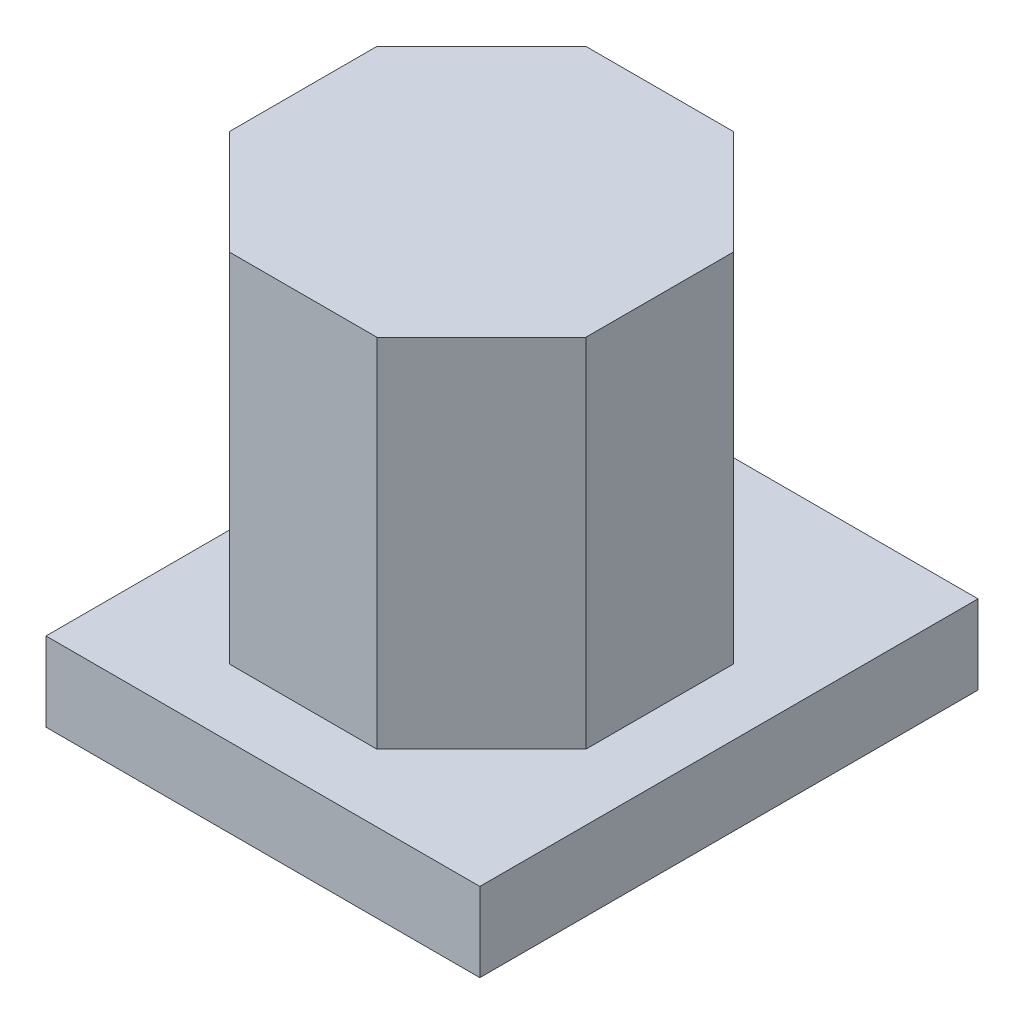
ISO-10303-21;
HEADER;
FILE_DESCRIPTION(('STEP AP214'),'2;1');
FILE_NAME('part.step','',(''),(''),'','','');
FILE_SCHEMA(('AUTOMOTIVE_DESIGN { 1 0 10303 214 1 1 1 1 }'));
ENDSEC;
DATA;
#1=APPLICATION_CONTEXT('core data for automotive mechanical design processes');
#2=APPLICATION_PROTOCOL_DEFINITION('international standard','automotive_design',2000,#1);
#3=PRODUCT_CONTEXT('',#1,'mechanical');
#4=PRODUCT('Part','Part','',(#3));
#5=PRODUCT_RELATED_PRODUCT_CATEGORY('part','',(#4));
#6=PRODUCT_DEFINITION_FORMATION('','',#4);
#7=PRODUCT_DEFINITION_CONTEXT('part definition',#1,'design');
#8=PRODUCT_DEFINITION('design','',#6,#7);
#9=PRODUCT_DEFINITION_SHAPE('','',#8);
#10=(LENGTH_UNIT() NAMED_UNIT(*) SI_UNIT(.MILLI.,.METRE.));
#11=(NAMED_UNIT(*) PLANE_ANGLE_UNIT() SI_UNIT($,.RADIAN.));
#12=(NAMED_UNIT(*) SI_UNIT($,.STERADIAN.) SOLID_ANGLE_UNIT());
#13=UNCERTAINTY_MEASURE_WITH_UNIT(LENGTH_MEASURE(1.E-05),#10,'distance_accuracy_value','');
#14=(GEOMETRIC_REPRESENTATION_CONTEXT(3) GLOBAL_UNCERTAINTY_ASSIGNED_CONTEXT((#13)) GLOBAL_UNIT_ASSIGNED_CONTEXT((#10,
#11,#12)) REPRESENTATION_CONTEXT('',''));
#15=CARTESIAN_POINT('',(0.,0.,0.));
#16=DIRECTION('',(0.,0.,1.));
#17=DIRECTION('',(1.,0.,0.));
#18=AXIS2_PLACEMENT_3D('',#15,#16,#17);
#19=CARTESIAN_POINT('',(380.,-709.,1072.));
#20=CARTESIAN_POINT('',(940.,-709.,1072.));
#21=CARTESIAN_POINT('',(380.,-709.,429.));
#22=CARTESIAN_POINT('',(940.,-709.,429.));
#23=B_SPLINE_SURFACE_WITH_KNOTS('',1,1,((#19,#20),(#21,#22)),.UNSPECIFIED.,.F.,.F.,.F.,(2,2),(2,
2),(-317.,326.),(-245.,315.),.UNSPECIFIED.);
#24=CARTESIAN_POINT('',(940.,-709.,1072.));
#25=CARTESIAN_POINT('',(940.,-709.,429.));
#26=B_SPLINE_CURVE_WITH_KNOTS('',1,(#24,#25),.UNSPECIFIED.,.F.,.F.,(2,2),(0.,643.),.UNSPECIFIED.);
#27=CARTESIAN_POINT('',(940.,-709.,1072.));
#28=VERTEX_POINT('',#27);
#29=CARTESIAN_POINT('',(940.,-709.,429.));
#30=VERTEX_POINT('',#29);
#31=EDGE_CURVE('E150',#28,#30,#26,.T.);
#32=CARTESIAN_POINT('',(380.,-709.,1072.));
#33=CARTESIAN_POINT('',(940.,-709.,1072.));
#34=B_SPLINE_CURVE_WITH_KNOTS('',1,(#32,#33),.UNSPECIFIED.,.F.,.F.,(2,2),(0.,560.),.UNSPECIFIED.);
#35=CARTESIAN_POINT('',(380.,-709.,1072.));
#36=VERTEX_POINT('',#35);
#37=EDGE_CURVE('E133',#36,#28,#34,.T.);
#38=CARTESIAN_POINT('',(380.,-709.,429.));
#39=CARTESIAN_POINT('',(380.,-709.,1072.));
#40=B_SPLINE_CURVE_WITH_KNOTS('',1,(#38,#39),.UNSPECIFIED.,.F.,.F.,(2,2),(0.,643.),.UNSPECIFIED.);
#41=CARTESIAN_POINT('',(380.,-709.,429.));
#42=VERTEX_POINT('',#41);
#43=EDGE_CURVE('E146',#42,#36,#40,.T.);
#44=CARTESIAN_POINT('',(940.,-709.,429.));
#45=CARTESIAN_POINT('',(380.,-709.,429.));
#46=B_SPLINE_CURVE_WITH_KNOTS('',1,(#44,#45),.UNSPECIFIED.,.F.,.F.,(2,2),(0.,560.),.UNSPECIFIED.);
#47=EDGE_CURVE('E153',#30,#42,#46,.T.);
#48=ORIENTED_EDGE('',*,*,#31,.F.);
#49=ORIENTED_EDGE('',*,*,#37,.F.);
#50=ORIENTED_EDGE('',*,*,#43,.F.);
#51=ORIENTED_EDGE('',*,*,#47,.F.);
#52=EDGE_LOOP('',(#48,#49,#50,#51));
#53=FACE_BOUND('',#52,.T.);
#54=ADVANCED_FACE('F18',(#53),#23,.T.);
#55=CARTESIAN_POINT('',(940.,-607.,1072.));
#56=CARTESIAN_POINT('',(940.,-709.,1072.));
#57=CARTESIAN_POINT('',(380.,-607.,1072.));
#58=CARTESIAN_POINT('',(380.,-709.,1072.));
#59=B_SPLINE_SURFACE_WITH_KNOTS('',1,1,((#55,#56),(#57,#58)),.UNSPECIFIED.,.F.,.F.,.F.,(2,2),(2,
2),(0.,560.),(0.,102.),.UNSPECIFIED.);
#60=CARTESIAN_POINT('',(940.,-607.,1072.));
#61=CARTESIAN_POINT('',(940.,-709.,1072.));
#62=B_SPLINE_CURVE_WITH_KNOTS('',1,(#60,#61),.UNSPECIFIED.,.F.,.F.,(2,2),(0.,102.),.UNSPECIFIED.);
#63=CARTESIAN_POINT('',(940.,-607.,1072.));
#64=VERTEX_POINT('',#63);
#65=EDGE_CURVE('E138',#64,#28,#62,.T.);
#66=CARTESIAN_POINT('',(940.,-607.,1072.));
#67=CARTESIAN_POINT('',(380.,-607.,1072.));
#68=B_SPLINE_CURVE_WITH_KNOTS('',1,(#66,#67),.UNSPECIFIED.,.F.,.F.,(2,2),(0.,560.),.UNSPECIFIED.);
#69=CARTESIAN_POINT('',(380.,-607.,1072.));
#70=VERTEX_POINT('',#69);
#71=EDGE_CURVE('E329',#64,#70,#68,.T.);
#72=CARTESIAN_POINT('',(380.,-709.,1072.));
#73=CARTESIAN_POINT('',(380.,-607.,1072.));
#74=B_SPLINE_CURVE_WITH_KNOTS('',1,(#72,#73),.UNSPECIFIED.,.F.,.F.,(2,2),(0.,102.),.UNSPECIFIED.);
#75=EDGE_CURVE('E142',#36,#70,#74,.T.);
#76=ORIENTED_EDGE('',*,*,#65,.F.);
#77=ORIENTED_EDGE('',*,*,#71,.T.);
#78=ORIENTED_EDGE('',*,*,#75,.F.);
#79=ORIENTED_EDGE('',*,*,#37,.T.);
#80=EDGE_LOOP('',(#76,#77,#78,#79));
#81=FACE_BOUND('',#80,.T.);
#82=ADVANCED_FACE('F136',(#81),#59,.T.);
#83=CARTESIAN_POINT('',(380.,-607.,1072.));
#84=CARTESIAN_POINT('',(380.,-709.,1072.));
#85=CARTESIAN_POINT('',(380.,-607.,429.));
#86=CARTESIAN_POINT('',(380.,-709.,429.));
#87=B_SPLINE_SURFACE_WITH_KNOTS('',1,1,((#83,#84),(#85,#86)),.UNSPECIFIED.,.F.,.F.,.F.,(2,2),(2,
2),(0.,643.),(0.,102.),.UNSPECIFIED.);
#88=CARTESIAN_POINT('',(380.,-607.,1072.));
#89=CARTESIAN_POINT('',(380.,-607.,429.));
#90=B_SPLINE_CURVE_WITH_KNOTS('',1,(#88,#89),.UNSPECIFIED.,.F.,.F.,(2,2),(0.,643.),.UNSPECIFIED.);
#91=CARTESIAN_POINT('',(380.,-607.,429.));
#92=VERTEX_POINT('',#91);
#93=EDGE_CURVE('E311',#70,#92,#90,.T.);
#94=CARTESIAN_POINT('',(380.,-709.,429.));
#95=CARTESIAN_POINT('',(380.,-607.,429.));
#96=B_SPLINE_CURVE_WITH_KNOTS('',1,(#94,#95),.UNSPECIFIED.,.F.,.F.,(2,2),(0.,102.),.UNSPECIFIED.);
#97=EDGE_CURVE('E170',#42,#92,#96,.T.);
#98=ORIENTED_EDGE('',*,*,#75,.T.);
#99=ORIENTED_EDGE('',*,*,#93,.T.);
#100=ORIENTED_EDGE('',*,*,#97,.F.);
#101=ORIENTED_EDGE('',*,*,#43,.T.);
#102=EDGE_LOOP('',(#98,#99,#100,#101));
#103=FACE_BOUND('',#102,.T.);
#104=ADVANCED_FACE('F276',(#103),#87,.T.);
#105=CARTESIAN_POINT('',(380.,-607.,429.));
#106=CARTESIAN_POINT('',(380.,-709.,429.));
#107=CARTESIAN_POINT('',(940.,-607.,429.));
#108=CARTESIAN_POINT('',(940.,-709.,429.));
#109=B_SPLINE_SURFACE_WITH_KNOTS('',1,1,((#105,#106),(#107,#108)),.UNSPECIFIED.,.F.,.F.,.F.,(2,
2),(2,2),(0.,560.),(0.,102.),.UNSPECIFIED.);
#110=CARTESIAN_POINT('',(380.,-607.,429.));
#111=CARTESIAN_POINT('',(940.,-607.,429.));
#112=B_SPLINE_CURVE_WITH_KNOTS('',1,(#110,#111),.UNSPECIFIED.,.F.,.F.,(2,2),(0.,560.),.UNSPECIFIED.);
#113=CARTESIAN_POINT('',(940.,-607.,429.));
#114=VERTEX_POINT('',#113);
#115=EDGE_CURVE('E261',#92,#114,#112,.T.);
#116=CARTESIAN_POINT('',(940.,-709.,429.));
#117=CARTESIAN_POINT('',(940.,-607.,429.));
#118=B_SPLINE_CURVE_WITH_KNOTS('',1,(#116,#117),.UNSPECIFIED.,.F.,.F.,(2,2),(0.,102.),.UNSPECIFIED.);
#119=EDGE_CURVE('E160',#30,#114,#118,.T.);
#120=ORIENTED_EDGE('',*,*,#97,.T.);
#121=ORIENTED_EDGE('',*,*,#115,.T.);
#122=ORIENTED_EDGE('',*,*,#119,.F.);
#123=ORIENTED_EDGE('',*,*,#47,.T.);
#124=EDGE_LOOP('',(#120,#121,#122,#123));
#125=FACE_BOUND('',#124,.T.);
#126=ADVANCED_FACE('F192',(#125),#109,.T.);
#127=CARTESIAN_POINT('',(940.,-607.,429.));
#128=CARTESIAN_POINT('',(940.,-709.,429.));
#129=CARTESIAN_POINT('',(940.,-607.,1072.));
#130=CARTESIAN_POINT('',(940.,-709.,1072.));
#131=B_SPLINE_SURFACE_WITH_KNOTS('',1,1,((#127,#128),(#129,#130)),.UNSPECIFIED.,.F.,.F.,.F.,(2,
2),(2,2),(0.,643.),(0.,102.),.UNSPECIFIED.);
#132=CARTESIAN_POINT('',(940.,-607.,429.));
#133=CARTESIAN_POINT('',(940.,-607.,1072.));
#134=B_SPLINE_CURVE_WITH_KNOTS('',1,(#132,#133),.UNSPECIFIED.,.F.,.F.,(2,2),(0.,643.),.UNSPECIFIED.);
#135=EDGE_CURVE('E166',#114,#64,#134,.T.);
#136=ORIENTED_EDGE('',*,*,#119,.T.);
#137=ORIENTED_EDGE('',*,*,#135,.T.);
#138=ORIENTED_EDGE('',*,*,#65,.T.);
#139=ORIENTED_EDGE('',*,*,#31,.T.);
#140=EDGE_LOOP('',(#136,#137,#138,#139));
#141=FACE_BOUND('',#140,.T.);
#142=ADVANCED_FACE('F164',(#141),#131,.T.);
#143=CARTESIAN_POINT('',(720.2691193458,-607.,525.));
#144=CARTESIAN_POINT('',(720.2691193458,-146.5,525.));
#145=CARTESIAN_POINT('',(529.7308806542,-607.,525.));
#146=CARTESIAN_POINT('',(529.7308806542,-146.5,525.));
#147=B_SPLINE_SURFACE_WITH_KNOTS('',1,1,((#143,#144),(#145,#146)),.UNSPECIFIED.,.F.,.F.,.F.,(2,
2),(2,2),(134.7308806542,325.2691193458),(30.,490.5),.UNSPECIFIED.);
#148=CARTESIAN_POINT('',(720.2691193458,-607.,525.));
#149=CARTESIAN_POINT('',(529.7308806542,-607.,525.));
#150=B_SPLINE_CURVE_WITH_KNOTS('',1,(#148,#149),.UNSPECIFIED.,.F.,.F.,(2,2),(134.7308806542,
325.2691193458),.UNSPECIFIED.);
#151=CARTESIAN_POINT('',(720.2691193458,-607.,525.));
#152=VERTEX_POINT('',#151);
#153=CARTESIAN_POINT('',(529.7308806542,-607.,525.));
#154=VERTEX_POINT('',#153);
#155=EDGE_CURVE('E371',#152,#154,#150,.T.);
#156=CARTESIAN_POINT('',(529.7308806542,-607.,525.));
#157=CARTESIAN_POINT('',(529.7308806542,-146.5,525.));
#158=B_SPLINE_CURVE_WITH_KNOTS('',1,(#156,#157),.UNSPECIFIED.,.F.,.F.,(2,2),(30.,490.5),.UNSPECIFIED.);
#159=CARTESIAN_POINT('',(529.7308806542,-146.5,525.));
#160=VERTEX_POINT('',#159);
#161=EDGE_CURVE('E354',#154,#160,#158,.T.);
#162=CARTESIAN_POINT('',(855.,-146.5,525.));
#163=CARTESIAN_POINT('',(395.,-146.5,525.));
#164=B_SPLINE_CURVE_WITH_KNOTS('',1,(#162,#163),.UNSPECIFIED.,.F.,.F.,(2,2),(-230.,230.),.UNSPECIFIED.);
#165=CARTESIAN_POINT('',(720.2691193458,-146.5,525.));
#166=VERTEX_POINT('',#165);
#167=EDGE_CURVE('E647',#166,#160,#164,.T.);
#168=CARTESIAN_POINT('',(720.2691193458,-146.5,525.));
#169=CARTESIAN_POINT('',(720.2691193458,-607.,525.));
#170=B_SPLINE_CURVE_WITH_KNOTS('',1,(#168,#169),.UNSPECIFIED.,.F.,.F.,(2,2),(30.,490.5),.UNSPECIFIED.);
#171=EDGE_CURVE('E658',#166,#152,#170,.T.);
#172=ORIENTED_EDGE('',*,*,#155,.T.);
#173=ORIENTED_EDGE('',*,*,#161,.T.);
#174=ORIENTED_EDGE('',*,*,#167,.F.);
#175=ORIENTED_EDGE('',*,*,#171,.T.);
#176=EDGE_LOOP('',(#172,#173,#174,#175));
#177=FACE_BOUND('',#176,.T.);
#178=ADVANCED_FACE('F191',(#177),#147,.T.);
#179=CARTESIAN_POINT('',(395.,-607.,659.73088065419));
#180=CARTESIAN_POINT('',(395.,-146.5,659.73088065419));
#181=CARTESIAN_POINT('',(529.7308806542,-607.,525.));
#182=CARTESIAN_POINT('',(529.7308806542,-146.5,525.));
#183=B_SPLINE_SURFACE_WITH_KNOTS('',1,1,((#179,#180),(#181,#182)),.UNSPECIFIED.,.F.,.F.,.F.,(2,
2),(2,2),(0.,190.5382386916),(-460.5,0.),.UNSPECIFIED.);
#184=CARTESIAN_POINT('',(529.7308806542,-607.,525.));
#185=CARTESIAN_POINT('',(395.,-607.,659.73088065419));
#186=B_SPLINE_CURVE_WITH_KNOTS('',1,(#184,#185),.UNSPECIFIED.,.F.,.F.,(2,2),(0.,190.5382386916),.UNSPECIFIED.);
#187=CARTESIAN_POINT('',(395.,-607.,659.73088065419));
#188=VERTEX_POINT('',#187);
#189=EDGE_CURVE('E678',#154,#188,#186,.T.);
#190=CARTESIAN_POINT('',(395.,-146.5,659.73088065419));
#191=CARTESIAN_POINT('',(395.,-607.,659.73088065419));
#192=B_SPLINE_CURVE_WITH_KNOTS('',1,(#190,#191),.UNSPECIFIED.,.F.,.F.,(2,2),(30.,490.5),.UNSPECIFIED.);
#193=CARTESIAN_POINT('',(395.,-146.5,659.73088065419));
#194=VERTEX_POINT('',#193);
#195=EDGE_CURVE('E345',#194,#188,#192,.T.);
#196=CARTESIAN_POINT('',(529.7308806542,-146.5,525.));
#197=CARTESIAN_POINT('',(524.117093960275,-146.5,530.613786693925));
#198=CARTESIAN_POINT('',(518.50330726635,-146.5,536.227573387849));
#199=CARTESIAN_POINT('',(507.2757338785,-146.5,547.455146775698));
#200=CARTESIAN_POINT('',(501.661947184575,-146.5,553.068933469623));
#201=CARTESIAN_POINT('',(490.434373796725,-146.5,564.296506857472));
#202=CARTESIAN_POINT('',(484.8205871028,-146.5,569.910293551397));
#203=CARTESIAN_POINT('',(473.59301371495,-146.5,581.137866939246));
#204=CARTESIAN_POINT('',(467.979227021025,-146.5,586.75165363317));
#205=CARTESIAN_POINT('',(456.751653633175,-146.5,597.97922702102));
#206=CARTESIAN_POINT('',(451.13786693925,-146.5,603.593013714944));
#207=CARTESIAN_POINT('',(439.9102935514,-146.5,614.820587102793));
#208=CARTESIAN_POINT('',(434.296506857475,-146.5,620.434373796718));
#209=CARTESIAN_POINT('',(423.068933469625,-146.5,631.661947184567));
#210=CARTESIAN_POINT('',(417.4551467757,-146.5,637.275733878492));
#211=CARTESIAN_POINT('',(406.22757338785,-146.5,648.503307266341));
#212=CARTESIAN_POINT('',(400.613786693925,-146.5,654.117093960265));
#213=CARTESIAN_POINT('',(395.,-146.5,659.73088065419));
#214=B_SPLINE_CURVE_WITH_KNOTS('',3,(#196,#197,#198,#199,#200,#201,#202,#203,#204,#205,#206,
#207,#208,#209,#210,#211,#212,#213),.UNSPECIFIED.,.F.,.F.,(4,2,2,2,2,2,2,2,4),(0.,
23.8172798364542,47.6345596729083,71.4518395093625,95.2691193458167,119.086399182271,
142.903679018725,166.720958855179,190.538238691633),.UNSPECIFIED.);
#215=EDGE_CURVE('E600',#160,#194,#214,.T.);
#216=ORIENTED_EDGE('',*,*,#189,.T.);
#217=ORIENTED_EDGE('',*,*,#195,.F.);
#218=ORIENTED_EDGE('',*,*,#215,.F.);
#219=ORIENTED_EDGE('',*,*,#161,.F.);
#220=EDGE_LOOP('',(#216,#217,#218,#219));
#221=FACE_BOUND('',#220,.T.);
#222=ADVANCED_FACE('F606',(#221),#183,.F.);
#223=CARTESIAN_POINT('',(395.,-607.,659.73088065419));
#224=CARTESIAN_POINT('',(395.,-146.5,659.73088065419));
#225=CARTESIAN_POINT('',(395.,-607.,850.2691193458));
#226=CARTESIAN_POINT('',(395.,-146.5,850.2691193458));
#227=B_SPLINE_SURFACE_WITH_KNOTS('',1,1,((#223,#224),(#225,#226)),.UNSPECIFIED.,.F.,.F.,.F.,(2,
2),(2,2),(134.7308806542,325.2691193458),(30.,490.5),.UNSPECIFIED.);
#228=CARTESIAN_POINT('',(395.,-607.,659.73088065419));
#229=CARTESIAN_POINT('',(395.,-607.,850.2691193458));
#230=B_SPLINE_CURVE_WITH_KNOTS('',1,(#228,#229),.UNSPECIFIED.,.F.,.F.,(2,2),(134.7308806542,
325.2691193458),.UNSPECIFIED.);
#231=CARTESIAN_POINT('',(395.,-607.,850.2691193458));
#232=VERTEX_POINT('',#231);
#233=EDGE_CURVE('E581',#188,#232,#230,.T.);
#234=CARTESIAN_POINT('',(395.,-607.,850.2691193458));
#235=CARTESIAN_POINT('',(395.,-146.5,850.2691193458));
#236=B_SPLINE_CURVE_WITH_KNOTS('',1,(#234,#235),.UNSPECIFIED.,.F.,.F.,(2,2),(30.,490.5),.UNSPECIFIED.);
#237=CARTESIAN_POINT('',(395.,-146.5,850.2691193458));
#238=VERTEX_POINT('',#237);
#239=EDGE_CURVE('E338',#232,#238,#236,.T.);
#240=CARTESIAN_POINT('',(395.,-146.5,525.));
#241=CARTESIAN_POINT('',(395.,-146.5,985.));
#242=B_SPLINE_CURVE_WITH_KNOTS('',1,(#240,#241),.UNSPECIFIED.,.F.,.F.,(2,2),(-230.,230.),.UNSPECIFIED.);
#243=EDGE_CURVE('E562',#194,#238,#242,.T.);
#244=ORIENTED_EDGE('',*,*,#233,.T.);
#245=ORIENTED_EDGE('',*,*,#239,.T.);
#246=ORIENTED_EDGE('',*,*,#243,.F.);
#247=ORIENTED_EDGE('',*,*,#195,.T.);
#248=EDGE_LOOP('',(#244,#245,#246,#247));
#249=FACE_BOUND('',#248,.T.);
#250=ADVANCED_FACE('F528',(#249),#227,.T.);
#251=CARTESIAN_POINT('',(529.7308806542,-607.,985.));
#252=CARTESIAN_POINT('',(529.7308806542,-146.5,985.));
#253=CARTESIAN_POINT('',(395.,-607.,850.2691193458));
#254=CARTESIAN_POINT('',(395.,-146.5,850.2691193458));
#255=B_SPLINE_SURFACE_WITH_KNOTS('',1,1,((#251,#252),(#253,#254)),.UNSPECIFIED.,.F.,.F.,.F.,(2,
2),(2,2),(0.,190.5382386916),(-460.5,0.),.UNSPECIFIED.);
#256=CARTESIAN_POINT('',(395.,-607.,850.2691193458));
#257=CARTESIAN_POINT('',(529.7308806542,-607.,985.));
#258=B_SPLINE_CURVE_WITH_KNOTS('',1,(#256,#257),.UNSPECIFIED.,.F.,.F.,(2,2),(0.,190.5382386916),.UNSPECIFIED.);
#259=CARTESIAN_POINT('',(529.7308806542,-607.,985.));
#260=VERTEX_POINT('',#259);
#261=EDGE_CURVE('E683',#232,#260,#258,.T.);
#262=CARTESIAN_POINT('',(529.7308806542,-146.5,985.));
#263=CARTESIAN_POINT('',(529.7308806542,-607.,985.));
#264=B_SPLINE_CURVE_WITH_KNOTS('',1,(#262,#263),.UNSPECIFIED.,.F.,.F.,(2,2),(30.,490.5),.UNSPECIFIED.);
#265=CARTESIAN_POINT('',(529.7308806542,-146.5,985.));
#266=VERTEX_POINT('',#265);
#267=EDGE_CURVE('E333',#266,#260,#264,.T.);
#268=CARTESIAN_POINT('',(395.,-146.5,850.2691193458));
#269=CARTESIAN_POINT('',(400.613786693925,-146.5,855.882906039725));
#270=CARTESIAN_POINT('',(406.22757338785,-146.5,861.49669273365));
#271=CARTESIAN_POINT('',(417.4551467757,-146.5,872.7242661215));
#272=CARTESIAN_POINT('',(423.068933469625,-146.5,878.338052815425));
#273=CARTESIAN_POINT('',(434.296506857475,-146.5,889.565626203275));
#274=CARTESIAN_POINT('',(439.9102935514,-146.5,895.1794128972));
#275=CARTESIAN_POINT('',(451.13786693925,-146.5,906.40698628505));
#276=CARTESIAN_POINT('',(456.751653633175,-146.5,912.020772978975));
#277=CARTESIAN_POINT('',(467.979227021025,-146.5,923.248346366825));
#278=CARTESIAN_POINT('',(473.59301371495,-146.5,928.86213306075));
#279=CARTESIAN_POINT('',(484.8205871028,-146.5,940.0897064486));
#280=CARTESIAN_POINT('',(490.434373796725,-146.5,945.703493142525));
#281=CARTESIAN_POINT('',(501.661947184575,-146.5,956.931066530375));
#282=CARTESIAN_POINT('',(507.2757338785,-146.5,962.5448532243));
#283=CARTESIAN_POINT('',(518.50330726635,-146.5,973.77242661215));
#284=CARTESIAN_POINT('',(524.117093960275,-146.5,979.386213306075));
#285=CARTESIAN_POINT('',(529.7308806542,-146.5,985.));
#286=B_SPLINE_CURVE_WITH_KNOTS('',3,(#268,#269,#270,#271,#272,#273,#274,#275,#276,#277,#278,
#279,#280,#281,#282,#283,#284,#285),.UNSPECIFIED.,.F.,.F.,(4,2,2,2,2,2,2,2,4),(0.,
23.8172798364552,47.6345596729101,71.4518395093652,95.2691193458203,119.086399182275,
142.90367901873,166.720958855185,190.53823869164),.UNSPECIFIED.);
#287=EDGE_CURVE('E511',#238,#266,#286,.T.);
#288=ORIENTED_EDGE('',*,*,#261,.T.);
#289=ORIENTED_EDGE('',*,*,#267,.F.);
#290=ORIENTED_EDGE('',*,*,#287,.F.);
#291=ORIENTED_EDGE('',*,*,#239,.F.);
#292=EDGE_LOOP('',(#288,#289,#290,#291));
#293=FACE_BOUND('',#292,.T.);
#294=ADVANCED_FACE('F517',(#293),#255,.F.);
#295=CARTESIAN_POINT('',(529.7308806542,-607.,985.));
#296=CARTESIAN_POINT('',(529.7308806542,-146.5,985.));
#297=CARTESIAN_POINT('',(720.2691193458,-607.,985.));
#298=CARTESIAN_POINT('',(720.2691193458,-146.5,985.));
#299=B_SPLINE_SURFACE_WITH_KNOTS('',1,1,((#295,#296),(#297,#298)),.UNSPECIFIED.,.F.,.F.,.F.,(2,
2),(2,2),(134.7308806542,325.2691193458),(30.,490.5),.UNSPECIFIED.);
#300=CARTESIAN_POINT('',(395.,-146.5,985.));
#301=CARTESIAN_POINT('',(855.,-146.5,985.));
#302=B_SPLINE_CURVE_WITH_KNOTS('',1,(#300,#301),.UNSPECIFIED.,.F.,.F.,(2,2),(-230.,230.),.UNSPECIFIED.);
#303=CARTESIAN_POINT('',(720.2691193458,-146.5,985.));
#304=VERTEX_POINT('',#303);
#305=EDGE_CURVE('E491',#266,#304,#302,.T.);
#306=CARTESIAN_POINT('',(529.7308806542,-607.,985.));
#307=CARTESIAN_POINT('',(720.2691193458,-607.,985.));
#308=B_SPLINE_CURVE_WITH_KNOTS('',1,(#306,#307),.UNSPECIFIED.,.F.,.F.,(2,2),(134.7308806542,
325.2691193458),.UNSPECIFIED.);
#309=CARTESIAN_POINT('',(720.2691193458,-607.,985.));
#310=VERTEX_POINT('',#309);
#311=EDGE_CURVE('E460',#260,#310,#308,.T.);
#312=CARTESIAN_POINT('',(720.2691193458,-607.,985.));
#313=CARTESIAN_POINT('',(720.2691193458,-146.5,985.));
#314=B_SPLINE_CURVE_WITH_KNOTS('',1,(#312,#313),.UNSPECIFIED.,.F.,.F.,(2,2),(30.,490.5),.UNSPECIFIED.);
#315=EDGE_CURVE('E481',#310,#304,#314,.T.);
#316=ORIENTED_EDGE('',*,*,#305,.F.);
#317=ORIENTED_EDGE('',*,*,#267,.T.);
#318=ORIENTED_EDGE('',*,*,#311,.T.);
#319=ORIENTED_EDGE('',*,*,#315,.T.);
#320=EDGE_LOOP('',(#316,#317,#318,#319));
#321=FACE_BOUND('',#320,.T.);
#322=ADVANCED_FACE('F394',(#321),#299,.T.);
#323=CARTESIAN_POINT('',(380.,-607.,1072.));
#324=CARTESIAN_POINT('',(940.,-607.,1072.));
#325=CARTESIAN_POINT('',(380.,-607.,429.));
#326=CARTESIAN_POINT('',(940.,-607.,429.));
#327=B_SPLINE_SURFACE_WITH_KNOTS('',1,1,((#323,#324),(#325,#326)),.UNSPECIFIED.,.F.,.F.,.F.,(2,
2),(2,2),(-317.,326.),(-245.,315.),.UNSPECIFIED.);
#328=CARTESIAN_POINT('',(720.2691193458,-607.,525.));
#329=CARTESIAN_POINT('',(725.882906039725,-607.,530.613786693925));
#330=CARTESIAN_POINT('',(731.49669273365,-607.,536.227573387849));
#331=CARTESIAN_POINT('',(742.7242661215,-607.,547.455146775698));
#332=CARTESIAN_POINT('',(748.338052815425,-607.,553.068933469623));
#333=CARTESIAN_POINT('',(759.565626203275,-607.,564.296506857472));
#334=CARTESIAN_POINT('',(765.1794128972,-607.,569.910293551397));
#335=CARTESIAN_POINT('',(776.40698628505,-607.,581.137866939246));
#336=CARTESIAN_POINT('',(782.020772978975,-607.,586.75165363317));
#337=CARTESIAN_POINT('',(793.248346366825,-607.,597.97922702102));
#338=CARTESIAN_POINT('',(798.86213306075,-607.,603.593013714944));
#339=CARTESIAN_POINT('',(810.0897064486,-607.,614.820587102793));
#340=CARTESIAN_POINT('',(815.703493142525,-607.,620.434373796718));
#341=CARTESIAN_POINT('',(826.931066530375,-607.,631.661947184567));
#342=CARTESIAN_POINT('',(832.5448532243,-607.,637.275733878492));
#343=CARTESIAN_POINT('',(843.77242661215,-607.,648.503307266341));
#344=CARTESIAN_POINT('',(849.386213306075,-607.,654.117093960265));
#345=CARTESIAN_POINT('',(855.,-607.,659.73088065419));
#346=B_SPLINE_CURVE_WITH_KNOTS('',3,(#328,#329,#330,#331,#332,#333,#334,#335,#336,#337,#338,
#339,#340,#341,#342,#343,#344,#345),.UNSPECIFIED.,.F.,.F.,(4,2,2,2,2,2,2,2,4),(0.,
23.8172798364542,47.6345596729084,71.4518395093626,95.2691193458168,119.086399182271,
142.903679018725,166.720958855179,190.538238691633),.UNSPECIFIED.);
#347=CARTESIAN_POINT('',(855.,-607.,659.73088065419));
#348=VERTEX_POINT('',#347);
#349=EDGE_CURVE('E690',#152,#348,#346,.T.);
#350=CARTESIAN_POINT('',(855.,-607.,850.2691193458));
#351=CARTESIAN_POINT('',(855.,-607.,659.73088065419));
#352=B_SPLINE_CURVE_WITH_KNOTS('',1,(#350,#351),.UNSPECIFIED.,.F.,.F.,(2,2),(134.7308806542,
325.2691193458),.UNSPECIFIED.);
#353=CARTESIAN_POINT('',(855.,-607.,850.2691193458));
#354=VERTEX_POINT('',#353);
#355=EDGE_CURVE('E722',#354,#348,#352,.T.);
#356=CARTESIAN_POINT('',(855.,-607.,850.2691193458));
#357=CARTESIAN_POINT('',(849.386213306075,-607.,855.882906039725));
#358=CARTESIAN_POINT('',(843.77242661215,-607.,861.49669273365));
#359=CARTESIAN_POINT('',(832.5448532243,-607.,872.7242661215));
#360=CARTESIAN_POINT('',(826.931066530375,-607.,878.338052815425));
#361=CARTESIAN_POINT('',(815.703493142525,-607.,889.565626203275));
#362=CARTESIAN_POINT('',(810.0897064486,-607.,895.1794128972));
#363=CARTESIAN_POINT('',(798.86213306075,-607.,906.40698628505));
#364=CARTESIAN_POINT('',(793.248346366825,-607.,912.020772978975));
#365=CARTESIAN_POINT('',(782.020772978975,-607.,923.248346366825));
#366=CARTESIAN_POINT('',(776.40698628505,-607.,928.86213306075));
#367=CARTESIAN_POINT('',(765.1794128972,-607.,940.0897064486));
#368=CARTESIAN_POINT('',(759.565626203275,-607.,945.703493142525));
#369=CARTESIAN_POINT('',(748.338052815425,-607.,956.931066530375));
#370=CARTESIAN_POINT('',(742.7242661215,-607.,962.5448532243));
#371=CARTESIAN_POINT('',(731.49669273365,-607.,973.77242661215));
#372=CARTESIAN_POINT('',(725.882906039725,-607.,979.386213306075));
#373=CARTESIAN_POINT('',(720.2691193458,-607.,985.));
#374=B_SPLINE_CURVE_WITH_KNOTS('',3,(#356,#357,#358,#359,#360,#361,#362,#363,#364,#365,#366,
#367,#368,#369,#370,#371,#372,#373),.UNSPECIFIED.,.F.,.F.,(4,2,2,2,2,2,2,2,4),(0.,
23.8172798364551,47.6345596729101,71.4518395093652,95.2691193458203,119.086399182275,
142.90367901873,166.720958855185,190.538238691641),.UNSPECIFIED.);
#375=EDGE_CURVE('E716',#354,#310,#374,.T.);
#376=ORIENTED_EDGE('',*,*,#261,.F.);
#377=ORIENTED_EDGE('',*,*,#233,.F.);
#378=ORIENTED_EDGE('',*,*,#189,.F.);
#379=ORIENTED_EDGE('',*,*,#155,.F.);
#380=ORIENTED_EDGE('',*,*,#349,.T.);
#381=ORIENTED_EDGE('',*,*,#355,.F.);
#382=ORIENTED_EDGE('',*,*,#375,.T.);
#383=ORIENTED_EDGE('',*,*,#311,.F.);
#384=EDGE_LOOP('',(#376,#377,#378,#379,#380,#381,#382,#383));
#385=FACE_BOUND('',#384,.T.);
#386=ORIENTED_EDGE('',*,*,#115,.F.);
#387=ORIENTED_EDGE('',*,*,#93,.F.);
#388=ORIENTED_EDGE('',*,*,#71,.F.);
#389=ORIENTED_EDGE('',*,*,#135,.F.);
#390=EDGE_LOOP('',(#386,#387,#388,#389));
#391=FACE_BOUND('',#390,.T.);
#392=ADVANCED_FACE('F367',(#385,#391),#327,.F.);
#393=CARTESIAN_POINT('',(720.2691193458,-607.,525.));
#394=CARTESIAN_POINT('',(720.2691193458,-146.5,525.));
#395=CARTESIAN_POINT('',(855.,-607.,659.73088065419));
#396=CARTESIAN_POINT('',(855.,-146.5,659.73088065419));
#397=B_SPLINE_SURFACE_WITH_KNOTS('',1,1,((#393,#394),(#395,#396)),.UNSPECIFIED.,.F.,.F.,.F.,(2,
2),(2,2),(0.,190.5382386916),(-460.5,0.),.UNSPECIFIED.);
#398=CARTESIAN_POINT('',(855.,-146.5,659.73088065419));
#399=CARTESIAN_POINT('',(849.386213306075,-146.5,654.117093960265));
#400=CARTESIAN_POINT('',(843.77242661215,-146.5,648.503307266341));
#401=CARTESIAN_POINT('',(832.5448532243,-146.5,637.275733878492));
#402=CARTESIAN_POINT('',(826.931066530375,-146.5,631.661947184567));
#403=CARTESIAN_POINT('',(815.703493142525,-146.5,620.434373796718));
#404=CARTESIAN_POINT('',(810.0897064486,-146.5,614.820587102793));
#405=CARTESIAN_POINT('',(798.86213306075,-146.5,603.593013714944));
#406=CARTESIAN_POINT('',(793.248346366825,-146.5,597.97922702102));
#407=CARTESIAN_POINT('',(782.020772978975,-146.5,586.75165363317));
#408=CARTESIAN_POINT('',(776.40698628505,-146.5,581.137866939246));
#409=CARTESIAN_POINT('',(765.1794128972,-146.5,569.910293551397));
#410=CARTESIAN_POINT('',(759.565626203275,-146.5,564.296506857472));
#411=CARTESIAN_POINT('',(748.338052815425,-146.5,553.068933469623));
#412=CARTESIAN_POINT('',(742.7242661215,-146.5,547.455146775698));
#413=CARTESIAN_POINT('',(731.49669273365,-146.5,536.227573387849));
#414=CARTESIAN_POINT('',(725.882906039725,-146.5,530.613786693924));
#415=CARTESIAN_POINT('',(720.2691193458,-146.5,525.));
#416=B_SPLINE_CURVE_WITH_KNOTS('',3,(#398,#399,#400,#401,#402,#403,#404,#405,#406,#407,#408,
#409,#410,#411,#412,#413,#414,#415),.UNSPECIFIED.,.F.,.F.,(4,2,2,2,2,2,2,2,4),(0.,
23.8172798364541,47.6345596729083,71.4518395093625,95.2691193458167,119.086399182271,
142.903679018725,166.720958855179,190.538238691633),.UNSPECIFIED.);
#417=CARTESIAN_POINT('',(855.,-146.5,659.73088065419));
#418=VERTEX_POINT('',#417);
#419=EDGE_CURVE('E697',#418,#166,#416,.T.);
#420=CARTESIAN_POINT('',(855.,-607.,659.73088065419));
#421=CARTESIAN_POINT('',(855.,-146.5,659.73088065419));
#422=B_SPLINE_CURVE_WITH_KNOTS('',1,(#420,#421),.UNSPECIFIED.,.F.,.F.,(2,2),(30.,490.5),.UNSPECIFIED.);
#423=EDGE_CURVE('E726',#348,#418,#422,.T.);
#424=ORIENTED_EDGE('',*,*,#349,.F.);
#425=ORIENTED_EDGE('',*,*,#171,.F.);
#426=ORIENTED_EDGE('',*,*,#419,.F.);
#427=ORIENTED_EDGE('',*,*,#423,.F.);
#428=EDGE_LOOP('',(#424,#425,#426,#427));
#429=FACE_BOUND('',#428,.T.);
#430=ADVANCED_FACE('F393',(#429),#397,.F.);
#431=CARTESIAN_POINT('',(855.,-146.5,985.));
#432=CARTESIAN_POINT('',(395.,-146.5,985.));
#433=CARTESIAN_POINT('',(855.,-146.5,525.));
#434=CARTESIAN_POINT('',(395.,-146.5,525.));
#435=B_SPLINE_SURFACE_WITH_KNOTS('',1,1,((#431,#432),(#433,#434)),.UNSPECIFIED.,.F.,.F.,.F.,(2,
2),(2,2),(-230.,230.),(-230.,230.),.UNSPECIFIED.);
#436=CARTESIAN_POINT('',(720.2691193458,-146.5,985.));
#437=CARTESIAN_POINT('',(725.882906039725,-146.5,979.386213306075));
#438=CARTESIAN_POINT('',(731.49669273365,-146.5,973.77242661215));
#439=CARTESIAN_POINT('',(742.7242661215,-146.5,962.5448532243));
#440=CARTESIAN_POINT('',(748.338052815425,-146.5,956.931066530375));
#441=CARTESIAN_POINT('',(759.565626203275,-146.5,945.703493142525));
#442=CARTESIAN_POINT('',(765.1794128972,-146.5,940.0897064486));
#443=CARTESIAN_POINT('',(776.40698628505,-146.5,928.86213306075));
#444=CARTESIAN_POINT('',(782.020772978975,-146.5,923.248346366825));
#445=CARTESIAN_POINT('',(793.248346366825,-146.5,912.020772978975));
#446=CARTESIAN_POINT('',(798.86213306075,-146.5,906.40698628505));
#447=CARTESIAN_POINT('',(810.0897064486,-146.5,895.1794128972));
#448=CARTESIAN_POINT('',(815.703493142525,-146.5,889.565626203275));
#449=CARTESIAN_POINT('',(826.931066530375,-146.5,878.338052815425));
#450=CARTESIAN_POINT('',(832.5448532243,-146.5,872.7242661215));
#451=CARTESIAN_POINT('',(843.77242661215,-146.5,861.49669273365));
#452=CARTESIAN_POINT('',(849.386213306075,-146.5,855.882906039725));
#453=CARTESIAN_POINT('',(855.,-146.5,850.2691193458));
#454=B_SPLINE_CURVE_WITH_KNOTS('',3,(#436,#437,#438,#439,#440,#441,#442,#443,#444,#445,#446,
#447,#448,#449,#450,#451,#452,#453),.UNSPECIFIED.,.F.,.F.,(4,2,2,2,2,2,2,2,4),(0.,
23.8172798364551,47.6345596729102,71.4518395093652,95.2691193458203,119.086399182275,
142.90367901873,166.720958855185,190.538238691641),.UNSPECIFIED.);
#455=CARTESIAN_POINT('',(855.,-146.5,850.2691193458));
#456=VERTEX_POINT('',#455);
#457=EDGE_CURVE('E44',#304,#456,#454,.T.);
#458=CARTESIAN_POINT('',(855.,-146.5,659.73088065419));
#459=CARTESIAN_POINT('',(855.,-146.5,850.2691193458));
#460=B_SPLINE_CURVE_WITH_KNOTS('',1,(#458,#459),.UNSPECIFIED.,.F.,.F.,(2,2),(134.7308806542,
325.2691193458),.UNSPECIFIED.);
#461=EDGE_CURVE('E32',#418,#456,#460,.T.);
#462=ORIENTED_EDGE('',*,*,#243,.T.);
#463=ORIENTED_EDGE('',*,*,#287,.T.);
#464=ORIENTED_EDGE('',*,*,#305,.T.);
#465=ORIENTED_EDGE('',*,*,#457,.T.);
#466=ORIENTED_EDGE('',*,*,#461,.F.);
#467=ORIENTED_EDGE('',*,*,#419,.T.);
#468=ORIENTED_EDGE('',*,*,#167,.T.);
#469=ORIENTED_EDGE('',*,*,#215,.T.);
#470=EDGE_LOOP('',(#462,#463,#464,#465,#466,#467,#468,#469));
#471=FACE_BOUND('',#470,.T.);
#472=ADVANCED_FACE('F822',(#471),#435,.T.);
#473=CARTESIAN_POINT('',(855.,-607.,850.2691193458));
#474=CARTESIAN_POINT('',(855.,-146.5,850.2691193458));
#475=CARTESIAN_POINT('',(720.2691193458,-607.,985.));
#476=CARTESIAN_POINT('',(720.2691193458,-146.5,985.));
#477=B_SPLINE_SURFACE_WITH_KNOTS('',1,1,((#473,#474),(#475,#476)),.UNSPECIFIED.,.F.,.F.,.F.,(2,
2),(2,2),(0.,190.5382386916),(-460.5,0.),.UNSPECIFIED.);
#478=CARTESIAN_POINT('',(855.,-146.5,850.2691193458));
#479=CARTESIAN_POINT('',(855.,-607.,850.2691193458));
#480=B_SPLINE_CURVE_WITH_KNOTS('',1,(#478,#479),.UNSPECIFIED.,.F.,.F.,(2,2),(30.,490.5),.UNSPECIFIED.);
#481=EDGE_CURVE('E11',#456,#354,#480,.T.);
#482=ORIENTED_EDGE('',*,*,#375,.F.);
#483=ORIENTED_EDGE('',*,*,#481,.F.);
#484=ORIENTED_EDGE('',*,*,#457,.F.);
#485=ORIENTED_EDGE('',*,*,#315,.F.);
#486=EDGE_LOOP('',(#482,#483,#484,#485));
#487=FACE_BOUND('',#486,.T.);
#488=ADVANCED_FACE('F759',(#487),#477,.F.);
#489=CARTESIAN_POINT('',(855.,-607.,850.2691193458));
#490=CARTESIAN_POINT('',(855.,-146.5,850.2691193458));
#491=CARTESIAN_POINT('',(855.,-607.,659.73088065419));
#492=CARTESIAN_POINT('',(855.,-146.5,659.73088065419));
#493=B_SPLINE_SURFACE_WITH_KNOTS('',1,1,((#489,#490),(#491,#492)),.UNSPECIFIED.,.F.,.F.,.F.,(2,
2),(2,2),(134.7308806542,325.2691193458),(30.,490.5),.UNSPECIFIED.);
#494=ORIENTED_EDGE('',*,*,#461,.T.);
#495=ORIENTED_EDGE('',*,*,#481,.T.);
#496=ORIENTED_EDGE('',*,*,#355,.T.);
#497=ORIENTED_EDGE('',*,*,#423,.T.);
#498=EDGE_LOOP('',(#494,#495,#496,#497));
#499=FACE_BOUND('',#498,.T.);
#500=ADVANCED_FACE('F738',(#499),#493,.T.);
#501=CLOSED_SHELL('',(#54,#82,#104,#126,#142,#178,#222,#250,#294,#322,#392,#430,#472,#488,#500));
#502=MANIFOLD_SOLID_BREP('B1',#501);
#503=ADVANCED_BREP_SHAPE_REPRESENTATION('',(#18,#502),#14);
#504=SHAPE_DEFINITION_REPRESENTATION(#9,#503);
ENDSEC;
END-ISO-10303-21;
